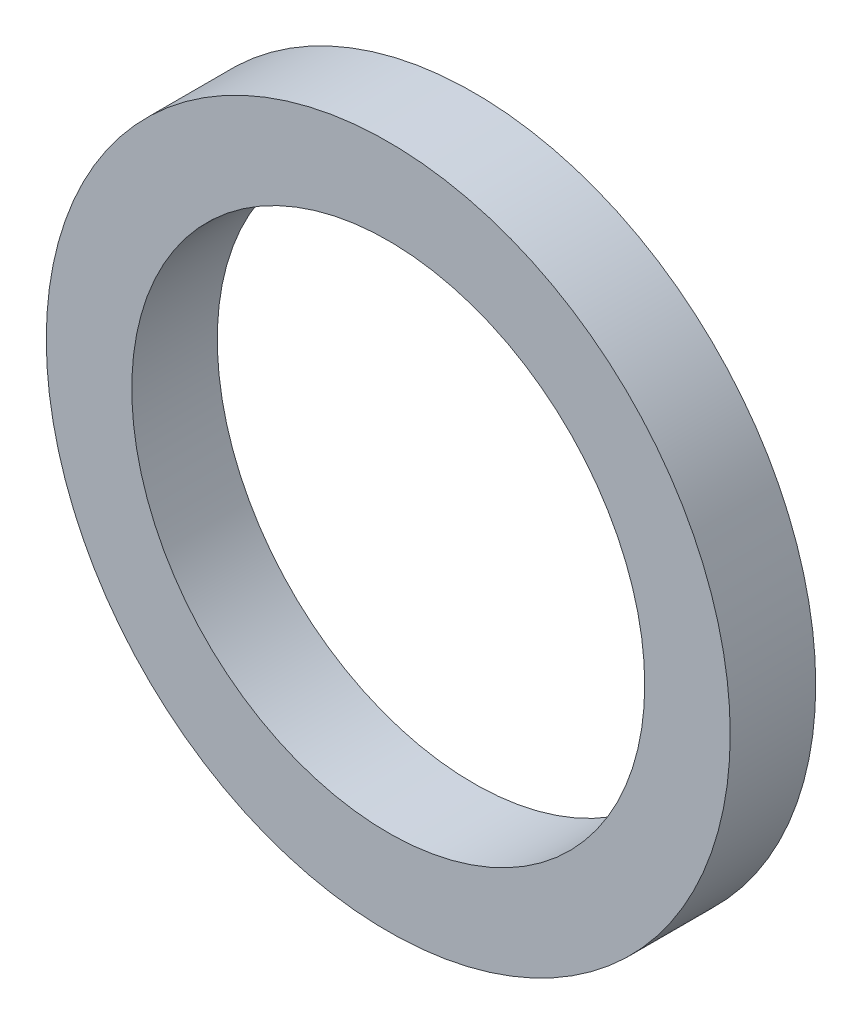
ISO-10303-21;
HEADER;
FILE_DESCRIPTION(('STEP AP214'),'2;1');
FILE_NAME('part.step','',(''),(''),'','','');
FILE_SCHEMA(('AUTOMOTIVE_DESIGN { 1 0 10303 214 1 1 1 1 }'));
ENDSEC;
DATA;
#1=APPLICATION_CONTEXT('core data for automotive mechanical design processes');
#2=APPLICATION_PROTOCOL_DEFINITION('international standard','automotive_design',2000,#1);
#3=PRODUCT_CONTEXT('',#1,'mechanical');
#4=PRODUCT('Part','Part','',(#3));
#5=PRODUCT_RELATED_PRODUCT_CATEGORY('part','',(#4));
#6=PRODUCT_DEFINITION_FORMATION('','',#4);
#7=PRODUCT_DEFINITION_CONTEXT('part definition',#1,'design');
#8=PRODUCT_DEFINITION('design','',#6,#7);
#9=PRODUCT_DEFINITION_SHAPE('','',#8);
#10=(LENGTH_UNIT() NAMED_UNIT(*) SI_UNIT(.MILLI.,.METRE.));
#11=(NAMED_UNIT(*) PLANE_ANGLE_UNIT() SI_UNIT($,.RADIAN.));
#12=(NAMED_UNIT(*) SI_UNIT($,.STERADIAN.) SOLID_ANGLE_UNIT());
#13=UNCERTAINTY_MEASURE_WITH_UNIT(LENGTH_MEASURE(1.E-05),#10,'distance_accuracy_value','');
#14=(GEOMETRIC_REPRESENTATION_CONTEXT(3) GLOBAL_UNCERTAINTY_ASSIGNED_CONTEXT((#13)) GLOBAL_UNIT_ASSIGNED_CONTEXT((#10,
#11,#12)) REPRESENTATION_CONTEXT('',''));
#15=CARTESIAN_POINT('',(0.,0.,0.));
#16=DIRECTION('',(0.,0.,1.));
#17=DIRECTION('',(1.,0.,0.));
#18=AXIS2_PLACEMENT_3D('',#15,#16,#17);
#19=CARTESIAN_POINT('',(0.,0.,1.));
#20=DIRECTION('',(0.,0.,1.));
#21=DIRECTION('',(1.,0.,0.));
#22=AXIS2_PLACEMENT_3D('',#19,#20,#21);
#23=PLANE('',#22);
#24=CARTESIAN_POINT('',(0.,0.,1.));
#25=DIRECTION('',(0.,0.,1.));
#26=DIRECTION('',(1.,0.,0.));
#27=AXIS2_PLACEMENT_3D('',#24,#25,#26);
#28=CIRCLE('',#27,4.);
#29=CARTESIAN_POINT('',(4.,0.,1.));
#30=VERTEX_POINT('',#29);
#31=EDGE_CURVE('E10',#30,#30,#28,.T.);
#32=ORIENTED_EDGE('',*,*,#31,.T.);
#33=EDGE_LOOP('',(#32));
#34=FACE_BOUND('',#33,.T.);
#35=CARTESIAN_POINT('',(0.,0.,1.));
#36=DIRECTION('',(0.,0.,1.));
#37=DIRECTION('',(1.,0.,0.));
#38=AXIS2_PLACEMENT_3D('',#35,#36,#37);
#39=CIRCLE('',#38,3.);
#40=CARTESIAN_POINT('',(3.,0.,1.));
#41=VERTEX_POINT('',#40);
#42=EDGE_CURVE('E41',#41,#41,#39,.T.);
#43=ORIENTED_EDGE('',*,*,#42,.F.);
#44=EDGE_LOOP('',(#43));
#45=FACE_BOUND('',#44,.T.);
#46=ADVANCED_FACE('F30',(#34,#45),#23,.T.);
#47=CARTESIAN_POINT('',(0.,0.,0.));
#48=DIRECTION('',(0.,0.,1.));
#49=DIRECTION('',(1.,0.,0.));
#50=AXIS2_PLACEMENT_3D('',#47,#48,#49);
#51=PLANE('',#50);
#52=CARTESIAN_POINT('',(0.,0.,0.));
#53=DIRECTION('',(0.,0.,1.));
#54=DIRECTION('',(1.,0.,0.));
#55=AXIS2_PLACEMENT_3D('',#52,#53,#54);
#56=CIRCLE('',#55,4.);
#57=CARTESIAN_POINT('',(4.,0.,0.));
#58=VERTEX_POINT('',#57);
#59=EDGE_CURVE('E34',#58,#58,#56,.T.);
#60=ORIENTED_EDGE('',*,*,#59,.F.);
#61=EDGE_LOOP('',(#60));
#62=FACE_BOUND('',#61,.T.);
#63=CARTESIAN_POINT('',(0.,0.,0.));
#64=DIRECTION('',(0.,0.,1.));
#65=DIRECTION('',(1.,0.,0.));
#66=AXIS2_PLACEMENT_3D('',#63,#64,#65);
#67=CIRCLE('',#66,3.);
#68=CARTESIAN_POINT('',(3.,0.,0.));
#69=VERTEX_POINT('',#68);
#70=EDGE_CURVE('E43',#69,#69,#67,.T.);
#71=ORIENTED_EDGE('',*,*,#70,.T.);
#72=EDGE_LOOP('',(#71));
#73=FACE_BOUND('',#72,.T.);
#74=ADVANCED_FACE('F53',(#62,#73),#51,.F.);
#75=CARTESIAN_POINT('',(0.,0.,1.));
#76=DIRECTION('',(0.,0.,-1.));
#77=DIRECTION('',(-1.,0.,0.));
#78=AXIS2_PLACEMENT_3D('',#75,#76,#77);
#79=CYLINDRICAL_SURFACE('',#78,4.);
#80=ORIENTED_EDGE('',*,*,#31,.F.);
#81=EDGE_LOOP('',(#80));
#82=FACE_BOUND('',#81,.T.);
#83=ORIENTED_EDGE('',*,*,#59,.T.);
#84=EDGE_LOOP('',(#83));
#85=FACE_BOUND('',#84,.T.);
#86=ADVANCED_FACE('F32',(#82,#85),#79,.T.);
#87=CARTESIAN_POINT('',(0.,0.,1.));
#88=DIRECTION('',(0.,0.,-1.));
#89=DIRECTION('',(-1.,0.,0.));
#90=AXIS2_PLACEMENT_3D('',#87,#88,#89);
#91=CYLINDRICAL_SURFACE('',#90,3.);
#92=ORIENTED_EDGE('',*,*,#42,.T.);
#93=EDGE_LOOP('',(#92));
#94=FACE_BOUND('',#93,.T.);
#95=ORIENTED_EDGE('',*,*,#70,.F.);
#96=EDGE_LOOP('',(#95));
#97=FACE_BOUND('',#96,.T.);
#98=ADVANCED_FACE('F49',(#94,#97),#91,.F.);
#99=CLOSED_SHELL('',(#46,#74,#86,#98));
#100=MANIFOLD_SOLID_BREP('B2',#99);
#101=ADVANCED_BREP_SHAPE_REPRESENTATION('',(#18,#100),#14);
#102=SHAPE_DEFINITION_REPRESENTATION(#9,#101);
ENDSEC;
END-ISO-10303-21;
